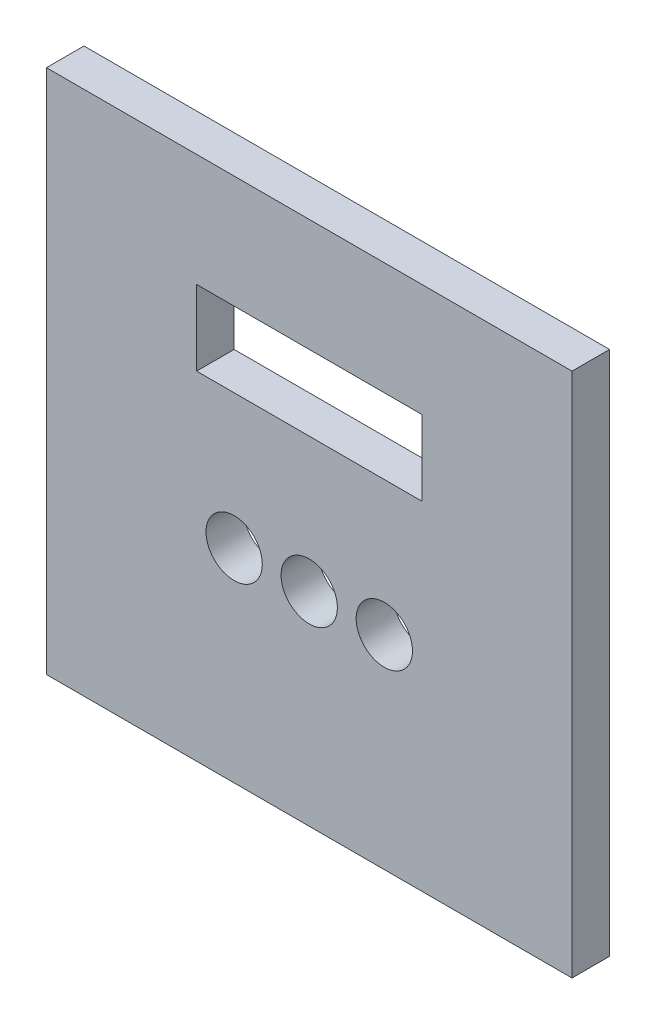
ISO-10303-21;
HEADER;
FILE_DESCRIPTION(('STEP AP214'),'2;1');
FILE_NAME('part.step','',(''),(''),'','','');
FILE_SCHEMA(('AUTOMOTIVE_DESIGN { 1 0 10303 214 1 1 1 1 }'));
ENDSEC;
DATA;
#1=APPLICATION_CONTEXT('core data for automotive mechanical design processes');
#2=APPLICATION_PROTOCOL_DEFINITION('international standard','automotive_design',2000,#1);
#3=PRODUCT_CONTEXT('',#1,'mechanical');
#4=PRODUCT('Part','Part','',(#3));
#5=PRODUCT_RELATED_PRODUCT_CATEGORY('part','',(#4));
#6=PRODUCT_DEFINITION_FORMATION('','',#4);
#7=PRODUCT_DEFINITION_CONTEXT('part definition',#1,'design');
#8=PRODUCT_DEFINITION('design','',#6,#7);
#9=PRODUCT_DEFINITION_SHAPE('','',#8);
#10=(LENGTH_UNIT() NAMED_UNIT(*) SI_UNIT(.MILLI.,.METRE.));
#11=(NAMED_UNIT(*) PLANE_ANGLE_UNIT() SI_UNIT($,.RADIAN.));
#12=(NAMED_UNIT(*) SI_UNIT($,.STERADIAN.) SOLID_ANGLE_UNIT());
#13=UNCERTAINTY_MEASURE_WITH_UNIT(LENGTH_MEASURE(1.E-05),#10,'distance_accuracy_value','');
#14=(GEOMETRIC_REPRESENTATION_CONTEXT(3) GLOBAL_UNCERTAINTY_ASSIGNED_CONTEXT((#13)) GLOBAL_UNIT_ASSIGNED_CONTEXT((#10,
#11,#12)) REPRESENTATION_CONTEXT('',''));
#15=CARTESIAN_POINT('',(0.,0.,0.));
#16=DIRECTION('',(0.,0.,1.));
#17=DIRECTION('',(1.,0.,0.));
#18=AXIS2_PLACEMENT_3D('',#15,#16,#17);
#19=CARTESIAN_POINT('',(70.,70.,10.));
#20=DIRECTION('',(-1.,0.,0.));
#21=DIRECTION('',(0.,-1.,0.));
#22=AXIS2_PLACEMENT_3D('',#19,#20,#21);
#23=PLANE('',#22);
#24=DIRECTION('',(0.,1.,0.));
#25=VECTOR('',#24,1.);
#26=CARTESIAN_POINT('',(70.,70.,0.));
#27=LINE('',#26,#25);
#28=CARTESIAN_POINT('',(70.,-70.,0.));
#29=VERTEX_POINT('',#28);
#30=CARTESIAN_POINT('',(70.,70.,0.));
#31=VERTEX_POINT('',#30);
#32=EDGE_CURVE('E151',#29,#31,#27,.T.);
#33=ORIENTED_EDGE('',*,*,#32,.T.);
#34=DIRECTION('',(0.,0.,-1.));
#35=VECTOR('',#34,1.);
#36=CARTESIAN_POINT('',(70.,70.,10.));
#37=LINE('',#36,#35);
#38=CARTESIAN_POINT('',(70.,70.,10.));
#39=VERTEX_POINT('',#38);
#40=EDGE_CURVE('E11',#39,#31,#37,.T.);
#41=ORIENTED_EDGE('',*,*,#40,.F.);
#42=DIRECTION('',(0.,1.,0.));
#43=VECTOR('',#42,1.);
#44=CARTESIAN_POINT('',(70.,70.,10.));
#45=LINE('',#44,#43);
#46=CARTESIAN_POINT('',(70.,-70.,10.));
#47=VERTEX_POINT('',#46);
#48=EDGE_CURVE('E157',#47,#39,#45,.T.);
#49=ORIENTED_EDGE('',*,*,#48,.F.);
#50=DIRECTION('',(0.,0.,-1.));
#51=VECTOR('',#50,1.);
#52=CARTESIAN_POINT('',(70.,-70.,10.));
#53=LINE('',#52,#51);
#54=EDGE_CURVE('E171',#47,#29,#53,.T.);
#55=ORIENTED_EDGE('',*,*,#54,.T.);
#56=EDGE_LOOP('',(#33,#41,#49,#55));
#57=FACE_BOUND('',#56,.T.);
#58=ADVANCED_FACE('F39',(#57),#23,.F.);
#59=CARTESIAN_POINT('',(-70.,70.,10.));
#60=DIRECTION('',(0.,-1.,0.));
#61=DIRECTION('',(0.,0.,-1.));
#62=AXIS2_PLACEMENT_3D('',#59,#60,#61);
#63=PLANE('',#62);
#64=DIRECTION('',(-1.,0.,0.));
#65=VECTOR('',#64,1.);
#66=CARTESIAN_POINT('',(-70.,70.,0.));
#67=LINE('',#66,#65);
#68=CARTESIAN_POINT('',(-70.,70.,0.));
#69=VERTEX_POINT('',#68);
#70=EDGE_CURVE('E175',#31,#69,#67,.T.);
#71=ORIENTED_EDGE('',*,*,#70,.T.);
#72=DIRECTION('',(0.,0.,-1.));
#73=VECTOR('',#72,1.);
#74=CARTESIAN_POINT('',(-70.,70.,10.));
#75=LINE('',#74,#73);
#76=CARTESIAN_POINT('',(-70.,70.,10.));
#77=VERTEX_POINT('',#76);
#78=EDGE_CURVE('E47',#77,#69,#75,.T.);
#79=ORIENTED_EDGE('',*,*,#78,.F.);
#80=DIRECTION('',(-1.,0.,0.));
#81=VECTOR('',#80,1.);
#82=CARTESIAN_POINT('',(-70.,70.,10.));
#83=LINE('',#82,#81);
#84=EDGE_CURVE('E161',#39,#77,#83,.T.);
#85=ORIENTED_EDGE('',*,*,#84,.F.);
#86=ORIENTED_EDGE('',*,*,#40,.T.);
#87=EDGE_LOOP('',(#71,#79,#85,#86));
#88=FACE_BOUND('',#87,.T.);
#89=ADVANCED_FACE('F209',(#88),#63,.F.);
#90=CARTESIAN_POINT('',(-70.,70.,10.));
#91=DIRECTION('',(1.,0.,0.));
#92=DIRECTION('',(0.,1.,0.));
#93=AXIS2_PLACEMENT_3D('',#90,#91,#92);
#94=PLANE('',#93);
#95=DIRECTION('',(0.,-1.,0.));
#96=VECTOR('',#95,1.);
#97=CARTESIAN_POINT('',(-70.,70.,0.));
#98=LINE('',#97,#96);
#99=CARTESIAN_POINT('',(-70.,-70.,0.));
#100=VERTEX_POINT('',#99);
#101=EDGE_CURVE('E178',#69,#100,#98,.T.);
#102=ORIENTED_EDGE('',*,*,#101,.T.);
#103=DIRECTION('',(0.,0.,-1.));
#104=VECTOR('',#103,1.);
#105=CARTESIAN_POINT('',(-70.,-70.,10.));
#106=LINE('',#105,#104);
#107=CARTESIAN_POINT('',(-70.,-70.,10.));
#108=VERTEX_POINT('',#107);
#109=EDGE_CURVE('E186',#108,#100,#106,.T.);
#110=ORIENTED_EDGE('',*,*,#109,.F.);
#111=DIRECTION('',(0.,-1.,0.));
#112=VECTOR('',#111,1.);
#113=CARTESIAN_POINT('',(-70.,70.,10.));
#114=LINE('',#113,#112);
#115=EDGE_CURVE('E165',#77,#108,#114,.T.);
#116=ORIENTED_EDGE('',*,*,#115,.F.);
#117=ORIENTED_EDGE('',*,*,#78,.T.);
#118=EDGE_LOOP('',(#102,#110,#116,#117));
#119=FACE_BOUND('',#118,.T.);
#120=ADVANCED_FACE('F195',(#119),#94,.F.);
#121=CARTESIAN_POINT('',(-70.,-70.,10.));
#122=DIRECTION('',(0.,1.,0.));
#123=DIRECTION('',(0.,0.,1.));
#124=AXIS2_PLACEMENT_3D('',#121,#122,#123);
#125=PLANE('',#124);
#126=DIRECTION('',(1.,0.,0.));
#127=VECTOR('',#126,1.);
#128=CARTESIAN_POINT('',(-70.,-70.,0.));
#129=LINE('',#128,#127);
#130=EDGE_CURVE('E162',#100,#29,#129,.T.);
#131=ORIENTED_EDGE('',*,*,#130,.T.);
#132=ORIENTED_EDGE('',*,*,#54,.F.);
#133=DIRECTION('',(1.,0.,0.));
#134=VECTOR('',#133,1.);
#135=CARTESIAN_POINT('',(-70.,-70.,10.));
#136=LINE('',#135,#134);
#137=EDGE_CURVE('E168',#108,#47,#136,.T.);
#138=ORIENTED_EDGE('',*,*,#137,.F.);
#139=ORIENTED_EDGE('',*,*,#109,.T.);
#140=EDGE_LOOP('',(#131,#132,#138,#139));
#141=FACE_BOUND('',#140,.T.);
#142=ADVANCED_FACE('F202',(#141),#125,.F.);
#143=CARTESIAN_POINT('',(0.,0.,10.));
#144=DIRECTION('',(0.,0.,1.));
#145=DIRECTION('',(1.,0.,0.));
#146=AXIS2_PLACEMENT_3D('',#143,#144,#145);
#147=PLANE('',#146);
#148=CARTESIAN_POINT('',(-20.,-15.8236553970249,10.));
#149=DIRECTION('',(0.,0.,1.));
#150=DIRECTION('',(1.,0.,0.));
#151=AXIS2_PLACEMENT_3D('',#148,#149,#150);
#152=CIRCLE('',#151,7.5);
#153=CARTESIAN_POINT('',(-12.5,-15.8236553970249,10.));
#154=VERTEX_POINT('',#153);
#155=EDGE_CURVE('E254',#154,#154,#152,.T.);
#156=ORIENTED_EDGE('',*,*,#155,.F.);
#157=EDGE_LOOP('',(#156));
#158=FACE_BOUND('',#157,.T.);
#159=CARTESIAN_POINT('',(0.,-15.8236553970249,10.));
#160=DIRECTION('',(0.,0.,1.));
#161=DIRECTION('',(1.,0.,0.));
#162=AXIS2_PLACEMENT_3D('',#159,#160,#161);
#163=CIRCLE('',#162,7.5);
#164=CARTESIAN_POINT('',(7.5,-15.8236553970249,10.));
#165=VERTEX_POINT('',#164);
#166=EDGE_CURVE('E262',#165,#165,#163,.T.);
#167=ORIENTED_EDGE('',*,*,#166,.F.);
#168=EDGE_LOOP('',(#167));
#169=FACE_BOUND('',#168,.T.);
#170=CARTESIAN_POINT('',(20.,-15.8236553970249,10.));
#171=DIRECTION('',(0.,0.,1.));
#172=DIRECTION('',(1.,0.,0.));
#173=AXIS2_PLACEMENT_3D('',#170,#171,#172);
#174=CIRCLE('',#173,7.5);
#175=CARTESIAN_POINT('',(27.5,-15.8236553970249,10.));
#176=VERTEX_POINT('',#175);
#177=EDGE_CURVE('E132',#176,#176,#174,.T.);
#178=ORIENTED_EDGE('',*,*,#177,.F.);
#179=EDGE_LOOP('',(#178));
#180=FACE_BOUND('',#179,.T.);
#181=DIRECTION('',(0.,1.,0.));
#182=VECTOR('',#181,1.);
#183=CARTESIAN_POINT('',(30.,40.,10.));
#184=LINE('',#183,#182);
#185=CARTESIAN_POINT('',(30.,20.,10.));
#186=VERTEX_POINT('',#185);
#187=CARTESIAN_POINT('',(30.,40.,10.));
#188=VERTEX_POINT('',#187);
#189=EDGE_CURVE('E54',#186,#188,#184,.T.);
#190=ORIENTED_EDGE('',*,*,#189,.F.);
#191=DIRECTION('',(1.,0.,0.));
#192=VECTOR('',#191,1.);
#193=CARTESIAN_POINT('',(-30.,20.,10.));
#194=LINE('',#193,#192);
#195=CARTESIAN_POINT('',(-30.,20.,10.));
#196=VERTEX_POINT('',#195);
#197=EDGE_CURVE('E125',#196,#186,#194,.T.);
#198=ORIENTED_EDGE('',*,*,#197,.F.);
#199=DIRECTION('',(0.,-1.,0.));
#200=VECTOR('',#199,1.);
#201=CARTESIAN_POINT('',(-30.,40.,10.));
#202=LINE('',#201,#200);
#203=CARTESIAN_POINT('',(-30.,40.,10.));
#204=VERTEX_POINT('',#203);
#205=EDGE_CURVE('E129',#204,#196,#202,.T.);
#206=ORIENTED_EDGE('',*,*,#205,.F.);
#207=DIRECTION('',(-1.,0.,0.));
#208=VECTOR('',#207,1.);
#209=CARTESIAN_POINT('',(-30.,40.,10.));
#210=LINE('',#209,#208);
#211=EDGE_CURVE('E141',#188,#204,#210,.T.);
#212=ORIENTED_EDGE('',*,*,#211,.F.);
#213=EDGE_LOOP('',(#190,#198,#206,#212));
#214=FACE_BOUND('',#213,.T.);
#215=ORIENTED_EDGE('',*,*,#48,.T.);
#216=ORIENTED_EDGE('',*,*,#84,.T.);
#217=ORIENTED_EDGE('',*,*,#115,.T.);
#218=ORIENTED_EDGE('',*,*,#137,.T.);
#219=EDGE_LOOP('',(#215,#216,#217,#218));
#220=FACE_BOUND('',#219,.T.);
#221=ADVANCED_FACE('F208',(#158,#169,#180,#214,#220),#147,.T.);
#222=CARTESIAN_POINT('',(0.,0.,0.));
#223=DIRECTION('',(0.,0.,1.));
#224=DIRECTION('',(1.,0.,0.));
#225=AXIS2_PLACEMENT_3D('',#222,#223,#224);
#226=PLANE('',#225);
#227=CARTESIAN_POINT('',(-20.,-15.8236553970249,0.));
#228=DIRECTION('',(0.,0.,1.));
#229=DIRECTION('',(1.,0.,0.));
#230=AXIS2_PLACEMENT_3D('',#227,#228,#229);
#231=CIRCLE('',#230,7.5);
#232=CARTESIAN_POINT('',(-12.5,-15.8236553970249,0.));
#233=VERTEX_POINT('',#232);
#234=EDGE_CURVE('E142',#233,#233,#231,.T.);
#235=ORIENTED_EDGE('',*,*,#234,.T.);
#236=EDGE_LOOP('',(#235));
#237=FACE_BOUND('',#236,.T.);
#238=CARTESIAN_POINT('',(0.,-15.8236553970249,0.));
#239=DIRECTION('',(0.,0.,1.));
#240=DIRECTION('',(1.,0.,0.));
#241=AXIS2_PLACEMENT_3D('',#238,#239,#240);
#242=CIRCLE('',#241,7.5);
#243=CARTESIAN_POINT('',(7.5,-15.8236553970249,0.));
#244=VERTEX_POINT('',#243);
#245=EDGE_CURVE('E256',#244,#244,#242,.T.);
#246=ORIENTED_EDGE('',*,*,#245,.T.);
#247=EDGE_LOOP('',(#246));
#248=FACE_BOUND('',#247,.T.);
#249=CARTESIAN_POINT('',(20.,-15.8236553970249,0.));
#250=DIRECTION('',(0.,0.,1.));
#251=DIRECTION('',(1.,0.,0.));
#252=AXIS2_PLACEMENT_3D('',#249,#250,#251);
#253=CIRCLE('',#252,7.5);
#254=CARTESIAN_POINT('',(27.5,-15.8236553970249,0.));
#255=VERTEX_POINT('',#254);
#256=EDGE_CURVE('E267',#255,#255,#253,.T.);
#257=ORIENTED_EDGE('',*,*,#256,.T.);
#258=EDGE_LOOP('',(#257));
#259=FACE_BOUND('',#258,.T.);
#260=DIRECTION('',(1.,0.,0.));
#261=VECTOR('',#260,1.);
#262=CARTESIAN_POINT('',(-30.,20.,0.));
#263=LINE('',#262,#261);
#264=CARTESIAN_POINT('',(-30.,20.,0.));
#265=VERTEX_POINT('',#264);
#266=CARTESIAN_POINT('',(30.,20.,0.));
#267=VERTEX_POINT('',#266);
#268=EDGE_CURVE('E113',#265,#267,#263,.T.);
#269=ORIENTED_EDGE('',*,*,#268,.T.);
#270=DIRECTION('',(0.,1.,0.));
#271=VECTOR('',#270,1.);
#272=CARTESIAN_POINT('',(30.,40.,0.));
#273=LINE('',#272,#271);
#274=CARTESIAN_POINT('',(30.,40.,0.));
#275=VERTEX_POINT('',#274);
#276=EDGE_CURVE('E106',#267,#275,#273,.T.);
#277=ORIENTED_EDGE('',*,*,#276,.T.);
#278=DIRECTION('',(-1.,0.,0.));
#279=VECTOR('',#278,1.);
#280=CARTESIAN_POINT('',(-30.,40.,0.));
#281=LINE('',#280,#279);
#282=CARTESIAN_POINT('',(-30.,40.,0.));
#283=VERTEX_POINT('',#282);
#284=EDGE_CURVE('E116',#275,#283,#281,.T.);
#285=ORIENTED_EDGE('',*,*,#284,.T.);
#286=DIRECTION('',(0.,-1.,0.));
#287=VECTOR('',#286,1.);
#288=CARTESIAN_POINT('',(-30.,40.,0.));
#289=LINE('',#288,#287);
#290=EDGE_CURVE('E62',#283,#265,#289,.T.);
#291=ORIENTED_EDGE('',*,*,#290,.T.);
#292=EDGE_LOOP('',(#269,#277,#285,#291));
#293=FACE_BOUND('',#292,.T.);
#294=ORIENTED_EDGE('',*,*,#32,.F.);
#295=ORIENTED_EDGE('',*,*,#130,.F.);
#296=ORIENTED_EDGE('',*,*,#101,.F.);
#297=ORIENTED_EDGE('',*,*,#70,.F.);
#298=EDGE_LOOP('',(#294,#295,#296,#297));
#299=FACE_BOUND('',#298,.T.);
#300=ADVANCED_FACE('F121',(#237,#248,#259,#293,#299),#226,.F.);
#301=CARTESIAN_POINT('',(30.,40.,0.));
#302=DIRECTION('',(1.,0.,0.));
#303=DIRECTION('',(0.,1.,0.));
#304=AXIS2_PLACEMENT_3D('',#301,#302,#303);
#305=PLANE('',#304);
#306=ORIENTED_EDGE('',*,*,#189,.T.);
#307=DIRECTION('',(0.,0.,1.));
#308=VECTOR('',#307,1.);
#309=CARTESIAN_POINT('',(30.,40.,0.));
#310=LINE('',#309,#308);
#311=EDGE_CURVE('E102',#275,#188,#310,.T.);
#312=ORIENTED_EDGE('',*,*,#311,.F.);
#313=ORIENTED_EDGE('',*,*,#276,.F.);
#314=DIRECTION('',(0.,0.,1.));
#315=VECTOR('',#314,1.);
#316=CARTESIAN_POINT('',(30.,20.,0.));
#317=LINE('',#316,#315);
#318=EDGE_CURVE('E148',#267,#186,#317,.T.);
#319=ORIENTED_EDGE('',*,*,#318,.T.);
#320=EDGE_LOOP('',(#306,#312,#313,#319));
#321=FACE_BOUND('',#320,.T.);
#322=ADVANCED_FACE('F104',(#321),#305,.F.);
#323=CARTESIAN_POINT('',(-30.,20.,0.));
#324=DIRECTION('',(0.,-1.,0.));
#325=DIRECTION('',(0.,0.,-1.));
#326=AXIS2_PLACEMENT_3D('',#323,#324,#325);
#327=PLANE('',#326);
#328=ORIENTED_EDGE('',*,*,#197,.T.);
#329=ORIENTED_EDGE('',*,*,#318,.F.);
#330=ORIENTED_EDGE('',*,*,#268,.F.);
#331=DIRECTION('',(0.,0.,1.));
#332=VECTOR('',#331,1.);
#333=CARTESIAN_POINT('',(-30.,20.,0.));
#334=LINE('',#333,#332);
#335=EDGE_CURVE('E152',#265,#196,#334,.T.);
#336=ORIENTED_EDGE('',*,*,#335,.T.);
#337=EDGE_LOOP('',(#328,#329,#330,#336));
#338=FACE_BOUND('',#337,.T.);
#339=ADVANCED_FACE('F227',(#338),#327,.F.);
#340=CARTESIAN_POINT('',(-30.,40.,0.));
#341=DIRECTION('',(-1.,0.,0.));
#342=DIRECTION('',(0.,-1.,0.));
#343=AXIS2_PLACEMENT_3D('',#340,#341,#342);
#344=PLANE('',#343);
#345=ORIENTED_EDGE('',*,*,#205,.T.);
#346=ORIENTED_EDGE('',*,*,#335,.F.);
#347=ORIENTED_EDGE('',*,*,#290,.F.);
#348=DIRECTION('',(0.,0.,1.));
#349=VECTOR('',#348,1.);
#350=CARTESIAN_POINT('',(-30.,40.,0.));
#351=LINE('',#350,#349);
#352=EDGE_CURVE('E112',#283,#204,#351,.T.);
#353=ORIENTED_EDGE('',*,*,#352,.T.);
#354=EDGE_LOOP('',(#345,#346,#347,#353));
#355=FACE_BOUND('',#354,.T.);
#356=ADVANCED_FACE('F231',(#355),#344,.F.);
#357=CARTESIAN_POINT('',(-30.,40.,0.));
#358=DIRECTION('',(0.,1.,0.));
#359=DIRECTION('',(0.,0.,1.));
#360=AXIS2_PLACEMENT_3D('',#357,#358,#359);
#361=PLANE('',#360);
#362=ORIENTED_EDGE('',*,*,#211,.T.);
#363=ORIENTED_EDGE('',*,*,#352,.F.);
#364=ORIENTED_EDGE('',*,*,#284,.F.);
#365=ORIENTED_EDGE('',*,*,#311,.T.);
#366=EDGE_LOOP('',(#362,#363,#364,#365));
#367=FACE_BOUND('',#366,.T.);
#368=ADVANCED_FACE('F117',(#367),#361,.F.);
#369=CARTESIAN_POINT('',(20.,-15.8236553970249,0.));
#370=DIRECTION('',(0.,0.,1.));
#371=DIRECTION('',(1.,0.,0.));
#372=AXIS2_PLACEMENT_3D('',#369,#370,#371);
#373=CYLINDRICAL_SURFACE('',#372,7.5);
#374=ORIENTED_EDGE('',*,*,#256,.F.);
#375=EDGE_LOOP('',(#374));
#376=FACE_BOUND('',#375,.T.);
#377=ORIENTED_EDGE('',*,*,#177,.T.);
#378=EDGE_LOOP('',(#377));
#379=FACE_BOUND('',#378,.T.);
#380=ADVANCED_FACE('F230',(#376,#379),#373,.F.);
#381=CARTESIAN_POINT('',(0.,-15.8236553970249,0.));
#382=DIRECTION('',(0.,0.,1.));
#383=DIRECTION('',(1.,0.,0.));
#384=AXIS2_PLACEMENT_3D('',#381,#382,#383);
#385=CYLINDRICAL_SURFACE('',#384,7.5);
#386=ORIENTED_EDGE('',*,*,#245,.F.);
#387=EDGE_LOOP('',(#386));
#388=FACE_BOUND('',#387,.T.);
#389=ORIENTED_EDGE('',*,*,#166,.T.);
#390=EDGE_LOOP('',(#389));
#391=FACE_BOUND('',#390,.T.);
#392=ADVANCED_FACE('F239',(#388,#391),#385,.F.);
#393=CARTESIAN_POINT('',(-20.,-15.8236553970249,0.));
#394=DIRECTION('',(0.,0.,1.));
#395=DIRECTION('',(1.,0.,0.));
#396=AXIS2_PLACEMENT_3D('',#393,#394,#395);
#397=CYLINDRICAL_SURFACE('',#396,7.5);
#398=ORIENTED_EDGE('',*,*,#234,.F.);
#399=EDGE_LOOP('',(#398));
#400=FACE_BOUND('',#399,.T.);
#401=ORIENTED_EDGE('',*,*,#155,.T.);
#402=EDGE_LOOP('',(#401));
#403=FACE_BOUND('',#402,.T.);
#404=ADVANCED_FACE('F243',(#400,#403),#397,.F.);
#405=CLOSED_SHELL('',(#58,#89,#120,#142,#221,#300,#322,#339,#356,#368,#380,#392,#404));
#406=MANIFOLD_SOLID_BREP('B2',#405);
#407=ADVANCED_BREP_SHAPE_REPRESENTATION('',(#18,#406),#14);
#408=SHAPE_DEFINITION_REPRESENTATION(#9,#407);
ENDSEC;
END-ISO-10303-21;
